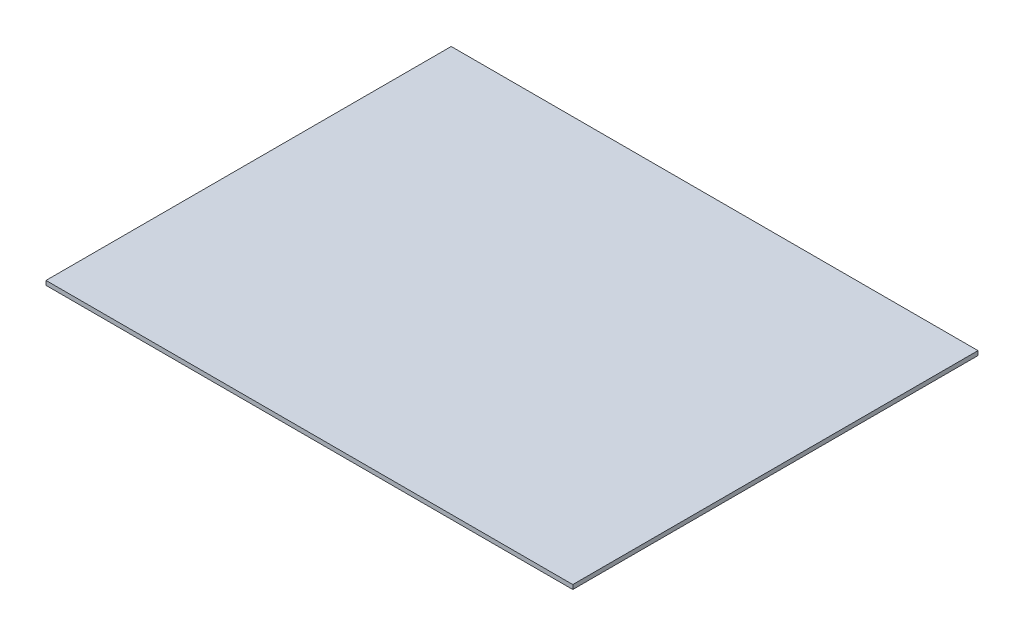
ISO-10303-21;
HEADER;
FILE_DESCRIPTION(('STEP AP214'),'2;1');
FILE_NAME('part.step','',(''),(''),'','','');
FILE_SCHEMA(('AUTOMOTIVE_DESIGN { 1 0 10303 214 1 1 1 1 }'));
ENDSEC;
DATA;
#1=APPLICATION_CONTEXT('core data for automotive mechanical design processes');
#2=APPLICATION_PROTOCOL_DEFINITION('international standard','automotive_design',2000,#1);
#3=PRODUCT_CONTEXT('',#1,'mechanical');
#4=PRODUCT('Part','Part','',(#3));
#5=PRODUCT_RELATED_PRODUCT_CATEGORY('part','',(#4));
#6=PRODUCT_DEFINITION_FORMATION('','',#4);
#7=PRODUCT_DEFINITION_CONTEXT('part definition',#1,'design');
#8=PRODUCT_DEFINITION('design','',#6,#7);
#9=PRODUCT_DEFINITION_SHAPE('','',#8);
#10=(LENGTH_UNIT() NAMED_UNIT(*) SI_UNIT(.MILLI.,.METRE.));
#11=(NAMED_UNIT(*) PLANE_ANGLE_UNIT() SI_UNIT($,.RADIAN.));
#12=(NAMED_UNIT(*) SI_UNIT($,.STERADIAN.) SOLID_ANGLE_UNIT());
#13=UNCERTAINTY_MEASURE_WITH_UNIT(LENGTH_MEASURE(1.E-05),#10,'distance_accuracy_value','');
#14=(GEOMETRIC_REPRESENTATION_CONTEXT(3) GLOBAL_UNCERTAINTY_ASSIGNED_CONTEXT((#13)) GLOBAL_UNIT_ASSIGNED_CONTEXT((#10,
#11,#12)) REPRESENTATION_CONTEXT('',''));
#15=CARTESIAN_POINT('',(0.,0.,0.));
#16=DIRECTION('',(0.,0.,1.));
#17=DIRECTION('',(1.,0.,0.));
#18=AXIS2_PLACEMENT_3D('',#15,#16,#17);
#19=CARTESIAN_POINT('',(-457.2,1.01600000000002,152.4));
#20=DIRECTION('',(0.,-1.,0.));
#21=DIRECTION('',(0.,0.,-1.));
#22=AXIS2_PLACEMENT_3D('',#19,#20,#21);
#23=PLANE('',#22);
#24=DIRECTION('',(0.,0.,-1.));
#25=VECTOR('',#24,1.);
#26=CARTESIAN_POINT('',(-209.55,1.01600000000002,-152.4));
#27=LINE('',#26,#25);
#28=CARTESIAN_POINT('',(-209.55,1.01600000000002,38.1));
#29=VERTEX_POINT('',#28);
#30=CARTESIAN_POINT('',(-209.55,1.01600000000002,-152.4));
#31=VERTEX_POINT('',#30);
#32=EDGE_CURVE('E97',#29,#31,#27,.T.);
#33=ORIENTED_EDGE('',*,*,#32,.T.);
#34=DIRECTION('',(-1.,0.,0.));
#35=VECTOR('',#34,1.);
#36=CARTESIAN_POINT('',(-457.2,1.01600000000002,-152.4));
#37=LINE('',#36,#35);
#38=CARTESIAN_POINT('',(-457.2,1.01600000000002,-152.4));
#39=VERTEX_POINT('',#38);
#40=EDGE_CURVE('E110',#31,#39,#37,.T.);
#41=ORIENTED_EDGE('',*,*,#40,.T.);
#42=DIRECTION('',(0.,0.,-1.));
#43=VECTOR('',#42,1.);
#44=CARTESIAN_POINT('',(-457.2,1.01600000000002,152.4));
#45=LINE('',#44,#43);
#46=CARTESIAN_POINT('',(-457.2,1.01600000000002,38.1));
#47=VERTEX_POINT('',#46);
#48=EDGE_CURVE('E12',#47,#39,#45,.T.);
#49=ORIENTED_EDGE('',*,*,#48,.F.);
#50=DIRECTION('',(1.,0.,0.));
#51=VECTOR('',#50,1.);
#52=CARTESIAN_POINT('',(-457.2,1.01600000000002,38.1));
#53=LINE('',#52,#51);
#54=EDGE_CURVE('E89',#47,#29,#53,.T.);
#55=ORIENTED_EDGE('',*,*,#54,.T.);
#56=EDGE_LOOP('',(#33,#41,#49,#55));
#57=FACE_BOUND('',#56,.T.);
#58=ADVANCED_FACE('F44',(#57),#23,.F.);
#59=CARTESIAN_POINT('',(-457.2,-1.01600000000002,152.4));
#60=DIRECTION('',(1.,0.,0.));
#61=DIRECTION('',(0.,0.,-1.));
#62=AXIS2_PLACEMENT_3D('',#59,#60,#61);
#63=PLANE('',#62);
#64=DIRECTION('',(0.,1.,0.));
#65=VECTOR('',#64,1.);
#66=CARTESIAN_POINT('',(-457.2,-1.01600000000002,38.1));
#67=LINE('',#66,#65);
#68=CARTESIAN_POINT('',(-457.2,-1.01600000000002,38.1));
#69=VERTEX_POINT('',#68);
#70=EDGE_CURVE('E85',#69,#47,#67,.T.);
#71=ORIENTED_EDGE('',*,*,#70,.T.);
#72=ORIENTED_EDGE('',*,*,#48,.T.);
#73=DIRECTION('',(0.,-1.,0.));
#74=VECTOR('',#73,1.);
#75=CARTESIAN_POINT('',(-457.2,-1.01600000000002,-152.4));
#76=LINE('',#75,#74);
#77=CARTESIAN_POINT('',(-457.2,-1.01600000000002,-152.4));
#78=VERTEX_POINT('',#77);
#79=EDGE_CURVE('E101',#39,#78,#76,.T.);
#80=ORIENTED_EDGE('',*,*,#79,.T.);
#81=DIRECTION('',(0.,0.,-1.));
#82=VECTOR('',#81,1.);
#83=CARTESIAN_POINT('',(-457.2,-1.01600000000002,152.4));
#84=LINE('',#83,#82);
#85=EDGE_CURVE('E52',#69,#78,#84,.T.);
#86=ORIENTED_EDGE('',*,*,#85,.F.);
#87=EDGE_LOOP('',(#71,#72,#80,#86));
#88=FACE_BOUND('',#87,.T.);
#89=ADVANCED_FACE('F99',(#88),#63,.F.);
#90=CARTESIAN_POINT('',(-457.2,-1.01600000000002,152.4));
#91=DIRECTION('',(0.,1.,0.));
#92=DIRECTION('',(0.,0.,1.));
#93=AXIS2_PLACEMENT_3D('',#90,#91,#92);
#94=PLANE('',#93);
#95=DIRECTION('',(0.,0.,-1.));
#96=VECTOR('',#95,1.);
#97=CARTESIAN_POINT('',(-209.55,-1.01600000000002,-152.4));
#98=LINE('',#97,#96);
#99=CARTESIAN_POINT('',(-209.55,-1.01600000000002,38.1));
#100=VERTEX_POINT('',#99);
#101=CARTESIAN_POINT('',(-209.55,-1.01600000000002,-152.4));
#102=VERTEX_POINT('',#101);
#103=EDGE_CURVE('E59',#100,#102,#98,.T.);
#104=ORIENTED_EDGE('',*,*,#103,.F.);
#105=DIRECTION('',(1.,0.,0.));
#106=VECTOR('',#105,1.);
#107=CARTESIAN_POINT('',(-457.2,-1.01600000000002,38.1));
#108=LINE('',#107,#106);
#109=EDGE_CURVE('E87',#69,#100,#108,.T.);
#110=ORIENTED_EDGE('',*,*,#109,.F.);
#111=ORIENTED_EDGE('',*,*,#85,.T.);
#112=DIRECTION('',(1.,0.,0.));
#113=VECTOR('',#112,1.);
#114=CARTESIAN_POINT('',(-457.2,-1.01600000000002,-152.4));
#115=LINE('',#114,#113);
#116=EDGE_CURVE('E104',#78,#102,#115,.T.);
#117=ORIENTED_EDGE('',*,*,#116,.T.);
#118=EDGE_LOOP('',(#104,#110,#111,#117));
#119=FACE_BOUND('',#118,.T.);
#120=ADVANCED_FACE('F95',(#119),#94,.F.);
#121=CARTESIAN_POINT('',(0.,0.,-152.4));
#122=DIRECTION('',(0.,0.,-1.));
#123=DIRECTION('',(-1.,0.,0.));
#124=AXIS2_PLACEMENT_3D('',#121,#122,#123);
#125=PLANE('',#124);
#126=ORIENTED_EDGE('',*,*,#40,.F.);
#127=DIRECTION('',(0.,1.,0.));
#128=VECTOR('',#127,1.);
#129=CARTESIAN_POINT('',(-209.55,-1.01600000000002,-152.4));
#130=LINE('',#129,#128);
#131=EDGE_CURVE('E113',#102,#31,#130,.T.);
#132=ORIENTED_EDGE('',*,*,#131,.F.);
#133=ORIENTED_EDGE('',*,*,#116,.F.);
#134=ORIENTED_EDGE('',*,*,#79,.F.);
#135=EDGE_LOOP('',(#126,#132,#133,#134));
#136=FACE_BOUND('',#135,.T.);
#137=ADVANCED_FACE('F129',(#136),#125,.T.);
#138=CARTESIAN_POINT('',(-209.55,-1.01600000000002,-152.4));
#139=DIRECTION('',(1.,0.,0.));
#140=DIRECTION('',(0.,0.,-1.));
#141=AXIS2_PLACEMENT_3D('',#138,#139,#140);
#142=PLANE('',#141);
#143=ORIENTED_EDGE('',*,*,#32,.F.);
#144=DIRECTION('',(0.,1.,0.));
#145=VECTOR('',#144,1.);
#146=CARTESIAN_POINT('',(-209.55,-1.01600000000002,38.1));
#147=LINE('',#146,#145);
#148=EDGE_CURVE('E93',#100,#29,#147,.T.);
#149=ORIENTED_EDGE('',*,*,#148,.F.);
#150=ORIENTED_EDGE('',*,*,#103,.T.);
#151=ORIENTED_EDGE('',*,*,#131,.T.);
#152=EDGE_LOOP('',(#143,#149,#150,#151));
#153=FACE_BOUND('',#152,.T.);
#154=ADVANCED_FACE('F130',(#153),#142,.T.);
#155=CARTESIAN_POINT('',(-457.2,-1.01600000000002,38.1));
#156=DIRECTION('',(0.,0.,1.));
#157=DIRECTION('',(1.,0.,0.));
#158=AXIS2_PLACEMENT_3D('',#155,#156,#157);
#159=PLANE('',#158);
#160=ORIENTED_EDGE('',*,*,#54,.F.);
#161=ORIENTED_EDGE('',*,*,#70,.F.);
#162=ORIENTED_EDGE('',*,*,#109,.T.);
#163=ORIENTED_EDGE('',*,*,#148,.T.);
#164=EDGE_LOOP('',(#160,#161,#162,#163));
#165=FACE_BOUND('',#164,.T.);
#166=ADVANCED_FACE('F86',(#165),#159,.T.);
#167=CLOSED_SHELL('',(#58,#89,#120,#137,#154,#166));
#168=MANIFOLD_SOLID_BREP('B2',#167);
#169=ADVANCED_BREP_SHAPE_REPRESENTATION('',(#18,#168),#14);
#170=SHAPE_DEFINITION_REPRESENTATION(#9,#169);
ENDSEC;
END-ISO-10303-21;
